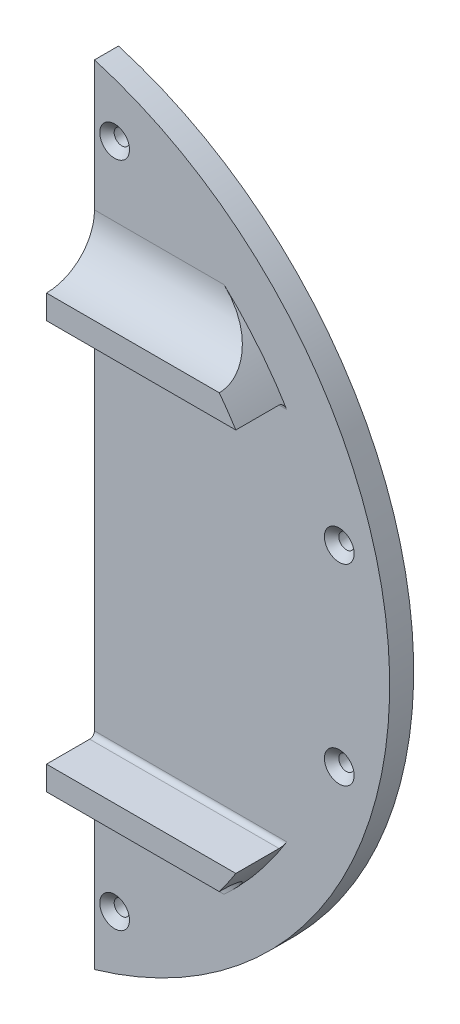
ISO-10303-21;
HEADER;
FILE_DESCRIPTION(('STEP AP214'),'2;1');
FILE_NAME('part.step','',(''),(''),'','','');
FILE_SCHEMA(('AUTOMOTIVE_DESIGN { 1 0 10303 214 1 1 1 1 }'));
ENDSEC;
DATA;
#1=APPLICATION_CONTEXT('core data for automotive mechanical design processes');
#2=APPLICATION_PROTOCOL_DEFINITION('international standard','automotive_design',2000,#1);
#3=PRODUCT_CONTEXT('',#1,'mechanical');
#4=PRODUCT('Part','Part','',(#3));
#5=PRODUCT_RELATED_PRODUCT_CATEGORY('part','',(#4));
#6=PRODUCT_DEFINITION_FORMATION('','',#4);
#7=PRODUCT_DEFINITION_CONTEXT('part definition',#1,'design');
#8=PRODUCT_DEFINITION('design','',#6,#7);
#9=PRODUCT_DEFINITION_SHAPE('','',#8);
#10=(LENGTH_UNIT() NAMED_UNIT(*) SI_UNIT(.MILLI.,.METRE.));
#11=(NAMED_UNIT(*) PLANE_ANGLE_UNIT() SI_UNIT($,.RADIAN.));
#12=(NAMED_UNIT(*) SI_UNIT($,.STERADIAN.) SOLID_ANGLE_UNIT());
#13=UNCERTAINTY_MEASURE_WITH_UNIT(LENGTH_MEASURE(1.E-05),#10,'distance_accuracy_value','');
#14=(GEOMETRIC_REPRESENTATION_CONTEXT(3) GLOBAL_UNCERTAINTY_ASSIGNED_CONTEXT((#13)) GLOBAL_UNIT_ASSIGNED_CONTEXT((#10,
#11,#12)) REPRESENTATION_CONTEXT('',''));
#15=CARTESIAN_POINT('',(0.,0.,0.));
#16=DIRECTION('',(0.,0.,1.));
#17=DIRECTION('',(1.,0.,0.));
#18=AXIS2_PLACEMENT_3D('',#15,#16,#17);
#19=CARTESIAN_POINT('',(0.,0.,5.));
#20=DIRECTION('',(0.,0.,1.));
#21=DIRECTION('',(1.,0.,0.));
#22=AXIS2_PLACEMENT_3D('',#19,#20,#21);
#23=PLANE('',#22);
#24=CARTESIAN_POINT('',(28.2,-69.5,5.));
#25=DIRECTION('',(0.,0.,1.));
#26=DIRECTION('',(1.,0.,0.));
#27=AXIS2_PLACEMENT_3D('',#24,#25,#26);
#28=CIRCLE('',#27,3.10000000000003);
#29=CARTESIAN_POINT('',(31.3,-69.5,5.));
#30=VERTEX_POINT('',#29);
#31=EDGE_CURVE('E249',#30,#30,#28,.F.);
#32=ORIENTED_EDGE('',*,*,#31,.T.);
#33=EDGE_LOOP('',(#32));
#34=FACE_BOUND('',#33,.T.);
#35=CARTESIAN_POINT('',(75.,-20.,5.));
#36=DIRECTION('',(0.,0.,1.));
#37=DIRECTION('',(1.,0.,0.));
#38=AXIS2_PLACEMENT_3D('',#35,#36,#37);
#39=CIRCLE('',#38,3.10000000000003);
#40=CARTESIAN_POINT('',(78.1,-20.,5.));
#41=VERTEX_POINT('',#40);
#42=EDGE_CURVE('E242',#41,#41,#39,.F.);
#43=ORIENTED_EDGE('',*,*,#42,.T.);
#44=EDGE_LOOP('',(#43));
#45=FACE_BOUND('',#44,.T.);
#46=CARTESIAN_POINT('',(74.9999999999999,20.,5.));
#47=DIRECTION('',(0.,0.,1.));
#48=DIRECTION('',(1.,0.,0.));
#49=AXIS2_PLACEMENT_3D('',#46,#47,#48);
#50=CIRCLE('',#49,3.10000000000003);
#51=CARTESIAN_POINT('',(78.1,20.,5.));
#52=VERTEX_POINT('',#51);
#53=EDGE_CURVE('E243',#52,#52,#50,.F.);
#54=ORIENTED_EDGE('',*,*,#53,.T.);
#55=EDGE_LOOP('',(#54));
#56=FACE_BOUND('',#55,.T.);
#57=CARTESIAN_POINT('',(28.2,69.5,5.));
#58=DIRECTION('',(0.,0.,1.));
#59=DIRECTION('',(1.,0.,0.));
#60=AXIS2_PLACEMENT_3D('',#57,#58,#59);
#61=CIRCLE('',#60,3.10000000000006);
#62=CARTESIAN_POINT('',(31.3000000000001,69.5,5.));
#63=VERTEX_POINT('',#62);
#64=EDGE_CURVE('E240',#63,#63,#61,.F.);
#65=ORIENTED_EDGE('',*,*,#64,.T.);
#66=EDGE_LOOP('',(#65));
#67=FACE_BOUND('',#66,.T.);
#68=DIRECTION('',(0.,-1.,0.));
#69=VECTOR('',#68,1.);
#70=CARTESIAN_POINT('',(24.,-82.0624761995396,5.));
#71=LINE('',#70,#69);
#72=CARTESIAN_POINT('',(24.,39.,5.));
#73=VERTEX_POINT('',#72);
#74=CARTESIAN_POINT('',(24.,-39.,5.));
#75=VERTEX_POINT('',#74);
#76=EDGE_CURVE('E219',#73,#75,#71,.T.);
#77=ORIENTED_EDGE('',*,*,#76,.T.);
#78=DIRECTION('',(-1.,0.,0.));
#79=VECTOR('',#78,1.);
#80=CARTESIAN_POINT('',(0.,-39.,5.));
#81=LINE('',#80,#79);
#82=CARTESIAN_POINT('',(64.0624695121879,-39.,5.));
#83=VERTEX_POINT('',#82);
#84=EDGE_CURVE('E409',#75,#83,#81,.F.);
#85=ORIENTED_EDGE('',*,*,#84,.T.);
#86=CARTESIAN_POINT('',(0.,0.,5.));
#87=DIRECTION('',(0.,0.,1.));
#88=DIRECTION('',(1.,0.,0.));
#89=AXIS2_PLACEMENT_3D('',#86,#87,#88);
#90=CIRCLE('',#89,75.);
#91=CARTESIAN_POINT('',(50.9901951359279,-55.,5.));
#92=VERTEX_POINT('',#91);
#93=EDGE_CURVE('E177',#92,#83,#90,.T.);
#94=ORIENTED_EDGE('',*,*,#93,.F.);
#95=DIRECTION('',(1.,0.,0.));
#96=VECTOR('',#95,1.);
#97=CARTESIAN_POINT('',(0.,-55.,5.));
#98=LINE('',#97,#96);
#99=CARTESIAN_POINT('',(24.,-55.,5.));
#100=VERTEX_POINT('',#99);
#101=EDGE_CURVE('E262',#92,#100,#98,.F.);
#102=ORIENTED_EDGE('',*,*,#101,.T.);
#103=CARTESIAN_POINT('',(24.,-82.0624761995396,5.));
#104=VERTEX_POINT('',#103);
#105=EDGE_CURVE('E213',#100,#104,#71,.T.);
#106=ORIENTED_EDGE('',*,*,#105,.T.);
#107=CARTESIAN_POINT('',(0.,0.,5.));
#108=DIRECTION('',(0.,0.,1.));
#109=DIRECTION('',(1.,0.,0.));
#110=AXIS2_PLACEMENT_3D('',#107,#108,#109);
#111=CIRCLE('',#110,85.5);
#112=CARTESIAN_POINT('',(24.,82.0624761995396,5.));
#113=VERTEX_POINT('',#112);
#114=EDGE_CURVE('E207',#104,#113,#111,.T.);
#115=ORIENTED_EDGE('',*,*,#114,.T.);
#116=CARTESIAN_POINT('',(24.,55.,5.));
#117=VERTEX_POINT('',#116);
#118=EDGE_CURVE('E214',#113,#117,#71,.T.);
#119=ORIENTED_EDGE('',*,*,#118,.T.);
#120=DIRECTION('',(-1.,0.,0.));
#121=VECTOR('',#120,1.);
#122=CARTESIAN_POINT('',(0.,55.,5.));
#123=LINE('',#122,#121);
#124=CARTESIAN_POINT('',(50.9901951359279,55.,5.));
#125=VERTEX_POINT('',#124);
#126=EDGE_CURVE('E270',#117,#125,#123,.F.);
#127=ORIENTED_EDGE('',*,*,#126,.T.);
#128=CARTESIAN_POINT('',(0.,0.,5.));
#129=DIRECTION('',(0.,0.,1.));
#130=DIRECTION('',(1.,0.,0.));
#131=AXIS2_PLACEMENT_3D('',#128,#129,#130);
#132=CIRCLE('',#131,75.);
#133=CARTESIAN_POINT('',(64.0624695121879,39.,5.));
#134=VERTEX_POINT('',#133);
#135=EDGE_CURVE('E154',#134,#125,#132,.T.);
#136=ORIENTED_EDGE('',*,*,#135,.F.);
#137=DIRECTION('',(1.,0.,0.));
#138=VECTOR('',#137,1.);
#139=CARTESIAN_POINT('',(0.,39.,5.));
#140=LINE('',#139,#138);
#141=EDGE_CURVE('E413',#134,#73,#140,.F.);
#142=ORIENTED_EDGE('',*,*,#141,.T.);
#143=EDGE_LOOP('',(#77,#85,#94,#102,#106,#115,#119,#127,#136,#142));
#144=FACE_BOUND('',#143,.T.);
#145=ADVANCED_FACE('F44',(#34,#45,#56,#67,#144),#23,.T.);
#146=CARTESIAN_POINT('',(0.,0.,0.));
#147=DIRECTION('',(0.,0.,1.));
#148=DIRECTION('',(1.,0.,0.));
#149=AXIS2_PLACEMENT_3D('',#146,#147,#148);
#150=PLANE('',#149);
#151=CARTESIAN_POINT('',(0.,0.,0.));
#152=DIRECTION('',(0.,0.,1.));
#153=DIRECTION('',(1.,0.,0.));
#154=AXIS2_PLACEMENT_3D('',#151,#152,#153);
#155=CIRCLE('',#154,85.5);
#156=CARTESIAN_POINT('',(24.,-82.0624761995396,0.));
#157=VERTEX_POINT('',#156);
#158=CARTESIAN_POINT('',(24.,82.0624761995396,0.));
#159=VERTEX_POINT('',#158);
#160=EDGE_CURVE('E208',#157,#159,#155,.T.);
#161=ORIENTED_EDGE('',*,*,#160,.F.);
#162=DIRECTION('',(0.,-1.,0.));
#163=VECTOR('',#162,1.);
#164=CARTESIAN_POINT('',(24.,-82.0624761995396,0.));
#165=LINE('',#164,#163);
#166=EDGE_CURVE('E212',#159,#157,#165,.T.);
#167=ORIENTED_EDGE('',*,*,#166,.F.);
#168=EDGE_LOOP('',(#161,#167));
#169=FACE_BOUND('',#168,.T.);
#170=CARTESIAN_POINT('',(75.,-20.,0.));
#171=DIRECTION('',(0.,0.,1.));
#172=DIRECTION('',(1.,0.,0.));
#173=AXIS2_PLACEMENT_3D('',#170,#171,#172);
#174=CIRCLE('',#173,1.6);
#175=CARTESIAN_POINT('',(76.6,-20.,0.));
#176=VERTEX_POINT('',#175);
#177=EDGE_CURVE('E204',#176,#176,#174,.T.);
#178=ORIENTED_EDGE('',*,*,#177,.T.);
#179=EDGE_LOOP('',(#178));
#180=FACE_BOUND('',#179,.T.);
#181=CARTESIAN_POINT('',(74.9999999999999,20.,0.));
#182=DIRECTION('',(0.,0.,1.));
#183=DIRECTION('',(-1.,0.,0.));
#184=AXIS2_PLACEMENT_3D('',#181,#182,#183);
#185=CIRCLE('',#184,1.6);
#186=CARTESIAN_POINT('',(73.3999999999999,20.,0.));
#187=VERTEX_POINT('',#186);
#188=EDGE_CURVE('E199',#187,#187,#185,.T.);
#189=ORIENTED_EDGE('',*,*,#188,.T.);
#190=EDGE_LOOP('',(#189));
#191=FACE_BOUND('',#190,.T.);
#192=CARTESIAN_POINT('',(28.2,-69.5,0.));
#193=DIRECTION('',(0.,0.,1.));
#194=DIRECTION('',(1.,0.,0.));
#195=AXIS2_PLACEMENT_3D('',#192,#193,#194);
#196=CIRCLE('',#195,1.6);
#197=CARTESIAN_POINT('',(29.8,-69.5,0.));
#198=VERTEX_POINT('',#197);
#199=EDGE_CURVE('E164',#198,#198,#196,.T.);
#200=ORIENTED_EDGE('',*,*,#199,.T.);
#201=EDGE_LOOP('',(#200));
#202=FACE_BOUND('',#201,.T.);
#203=CARTESIAN_POINT('',(28.2,69.5,0.));
#204=DIRECTION('',(0.,0.,1.));
#205=DIRECTION('',(-1.,0.,0.));
#206=AXIS2_PLACEMENT_3D('',#203,#204,#205);
#207=CIRCLE('',#206,1.6);
#208=CARTESIAN_POINT('',(26.6,69.5,0.));
#209=VERTEX_POINT('',#208);
#210=EDGE_CURVE('E157',#209,#209,#207,.T.);
#211=ORIENTED_EDGE('',*,*,#210,.T.);
#212=EDGE_LOOP('',(#211));
#213=FACE_BOUND('',#212,.T.);
#214=ADVANCED_FACE('F360',(#169,#180,#191,#202,#213),#150,.F.);
#215=CARTESIAN_POINT('',(0.,0.,5.));
#216=DIRECTION('',(0.,0.,-1.));
#217=DIRECTION('',(-1.,0.,0.));
#218=AXIS2_PLACEMENT_3D('',#215,#216,#217);
#219=CYLINDRICAL_SURFACE('',#218,85.5);
#220=ORIENTED_EDGE('',*,*,#160,.T.);
#221=DIRECTION('',(0.,0.,-1.));
#222=VECTOR('',#221,1.);
#223=CARTESIAN_POINT('',(24.,82.0624761995396,5.));
#224=LINE('',#223,#222);
#225=EDGE_CURVE('E229',#113,#159,#224,.T.);
#226=ORIENTED_EDGE('',*,*,#225,.F.);
#227=ORIENTED_EDGE('',*,*,#114,.F.);
#228=DIRECTION('',(0.,0.,-1.));
#229=VECTOR('',#228,1.);
#230=CARTESIAN_POINT('',(24.,-82.0624761995396,5.));
#231=LINE('',#230,#229);
#232=EDGE_CURVE('E218',#104,#157,#231,.T.);
#233=ORIENTED_EDGE('',*,*,#232,.T.);
#234=EDGE_LOOP('',(#220,#226,#227,#233));
#235=FACE_BOUND('',#234,.T.);
#236=ADVANCED_FACE('F363',(#235),#219,.T.);
#237=CARTESIAN_POINT('',(24.,-82.0624761995396,5.));
#238=DIRECTION('',(1.,0.,0.));
#239=DIRECTION('',(0.,0.,-1.));
#240=AXIS2_PLACEMENT_3D('',#237,#238,#239);
#241=PLANE('',#240);
#242=ORIENTED_EDGE('',*,*,#166,.T.);
#243=ORIENTED_EDGE('',*,*,#232,.F.);
#244=ORIENTED_EDGE('',*,*,#105,.F.);
#245=CARTESIAN_POINT('',(24.,-55.,15.));
#246=DIRECTION('',(1.,0.,0.));
#247=DIRECTION('',(0.,0.,-1.));
#248=AXIS2_PLACEMENT_3D('',#245,#246,#247);
#249=CIRCLE('',#248,10.);
#250=CARTESIAN_POINT('',(24.,-45.,15.));
#251=VERTEX_POINT('',#250);
#252=EDGE_CURVE('E424',#100,#251,#249,.T.);
#253=ORIENTED_EDGE('',*,*,#252,.T.);
#254=DIRECTION('',(0.,-1.,0.));
#255=VECTOR('',#254,1.);
#256=CARTESIAN_POINT('',(24.,-45.,15.));
#257=LINE('',#256,#255);
#258=CARTESIAN_POINT('',(24.,-40.,15.));
#259=VERTEX_POINT('',#258);
#260=EDGE_CURVE('E190',#259,#251,#257,.T.);
#261=ORIENTED_EDGE('',*,*,#260,.F.);
#262=DIRECTION('',(0.,0.,-1.));
#263=VECTOR('',#262,1.);
#264=CARTESIAN_POINT('',(24.,-40.,15.));
#265=LINE('',#264,#263);
#266=CARTESIAN_POINT('',(24.,-40.,6.));
#267=VERTEX_POINT('',#266);
#268=EDGE_CURVE('E172',#259,#267,#265,.T.);
#269=ORIENTED_EDGE('',*,*,#268,.T.);
#270=CARTESIAN_POINT('',(24.,-39.,6.));
#271=DIRECTION('',(1.,0.,0.));
#272=DIRECTION('',(0.,0.,-1.));
#273=AXIS2_PLACEMENT_3D('',#270,#271,#272);
#274=CIRCLE('',#273,1.);
#275=EDGE_CURVE('E317',#267,#75,#274,.T.);
#276=ORIENTED_EDGE('',*,*,#275,.T.);
#277=ORIENTED_EDGE('',*,*,#76,.F.);
#278=CARTESIAN_POINT('',(24.,39.,6.));
#279=DIRECTION('',(1.,0.,0.));
#280=DIRECTION('',(0.,0.,-1.));
#281=AXIS2_PLACEMENT_3D('',#278,#279,#280);
#282=CIRCLE('',#281,1.);
#283=CARTESIAN_POINT('',(24.,40.,6.));
#284=VERTEX_POINT('',#283);
#285=EDGE_CURVE('E11',#73,#284,#282,.T.);
#286=ORIENTED_EDGE('',*,*,#285,.T.);
#287=DIRECTION('',(0.,0.,-1.));
#288=VECTOR('',#287,1.);
#289=CARTESIAN_POINT('',(24.,40.,15.));
#290=LINE('',#289,#288);
#291=CARTESIAN_POINT('',(24.,40.,15.));
#292=VERTEX_POINT('',#291);
#293=EDGE_CURVE('E139',#292,#284,#290,.T.);
#294=ORIENTED_EDGE('',*,*,#293,.F.);
#295=DIRECTION('',(0.,-1.,0.));
#296=VECTOR('',#295,1.);
#297=CARTESIAN_POINT('',(24.,45.,15.));
#298=LINE('',#297,#296);
#299=CARTESIAN_POINT('',(24.,45.,15.));
#300=VERTEX_POINT('',#299);
#301=EDGE_CURVE('E150',#300,#292,#298,.T.);
#302=ORIENTED_EDGE('',*,*,#301,.F.);
#303=CARTESIAN_POINT('',(24.,55.,15.));
#304=DIRECTION('',(1.,0.,0.));
#305=DIRECTION('',(0.,0.,-1.));
#306=AXIS2_PLACEMENT_3D('',#303,#304,#305);
#307=CIRCLE('',#306,10.);
#308=EDGE_CURVE('E271',#300,#117,#307,.T.);
#309=ORIENTED_EDGE('',*,*,#308,.T.);
#310=ORIENTED_EDGE('',*,*,#118,.F.);
#311=ORIENTED_EDGE('',*,*,#225,.T.);
#312=EDGE_LOOP('',(#242,#243,#244,#253,#261,#269,#276,#277,#286,#294,#302,#309,#310,#311));
#313=FACE_BOUND('',#312,.T.);
#314=ADVANCED_FACE('F160',(#313),#241,.F.);
#315=CARTESIAN_POINT('',(75.,-20.,5.));
#316=DIRECTION('',(0.,0.,-1.));
#317=DIRECTION('',(-1.,0.,0.));
#318=AXIS2_PLACEMENT_3D('',#315,#316,#317);
#319=CYLINDRICAL_SURFACE('',#318,1.6);
#320=CARTESIAN_POINT('',(75.,-20.,3.49999999999998));
#321=DIRECTION('',(0.,0.,1.));
#322=DIRECTION('',(1.,0.,0.));
#323=AXIS2_PLACEMENT_3D('',#320,#321,#322);
#324=CIRCLE('',#323,1.6);
#325=CARTESIAN_POINT('',(76.6,-20.,3.49999999999998));
#326=VERTEX_POINT('',#325);
#327=EDGE_CURVE('E251',#326,#326,#324,.T.);
#328=ORIENTED_EDGE('',*,*,#327,.T.);
#329=EDGE_LOOP('',(#328));
#330=FACE_BOUND('',#329,.T.);
#331=ORIENTED_EDGE('',*,*,#177,.F.);
#332=EDGE_LOOP('',(#331));
#333=FACE_BOUND('',#332,.T.);
#334=ADVANCED_FACE('F348',(#330,#333),#319,.F.);
#335=CARTESIAN_POINT('',(74.9999999999999,20.,5.));
#336=DIRECTION('',(0.,0.,-1.));
#337=DIRECTION('',(-1.,0.,0.));
#338=AXIS2_PLACEMENT_3D('',#335,#336,#337);
#339=CYLINDRICAL_SURFACE('',#338,1.6);
#340=CARTESIAN_POINT('',(74.9999999999999,20.,3.49999999999998));
#341=DIRECTION('',(0.,0.,1.));
#342=DIRECTION('',(1.,0.,0.));
#343=AXIS2_PLACEMENT_3D('',#340,#341,#342);
#344=CIRCLE('',#343,1.6);
#345=CARTESIAN_POINT('',(76.6,20.,3.49999999999998));
#346=VERTEX_POINT('',#345);
#347=EDGE_CURVE('E258',#346,#346,#344,.T.);
#348=ORIENTED_EDGE('',*,*,#347,.T.);
#349=EDGE_LOOP('',(#348));
#350=FACE_BOUND('',#349,.T.);
#351=ORIENTED_EDGE('',*,*,#188,.F.);
#352=EDGE_LOOP('',(#351));
#353=FACE_BOUND('',#352,.T.);
#354=ADVANCED_FACE('F347',(#350,#353),#339,.F.);
#355=CARTESIAN_POINT('',(28.2,-69.5,5.));
#356=DIRECTION('',(0.,0.,-1.));
#357=DIRECTION('',(-1.,0.,0.));
#358=AXIS2_PLACEMENT_3D('',#355,#356,#357);
#359=CYLINDRICAL_SURFACE('',#358,1.6);
#360=CARTESIAN_POINT('',(28.2,-69.5,3.49999999999998));
#361=DIRECTION('',(0.,0.,1.));
#362=DIRECTION('',(1.,0.,0.));
#363=AXIS2_PLACEMENT_3D('',#360,#361,#362);
#364=CIRCLE('',#363,1.6);
#365=CARTESIAN_POINT('',(29.8,-69.5,3.49999999999998));
#366=VERTEX_POINT('',#365);
#367=EDGE_CURVE('E231',#366,#366,#364,.T.);
#368=ORIENTED_EDGE('',*,*,#367,.T.);
#369=EDGE_LOOP('',(#368));
#370=FACE_BOUND('',#369,.T.);
#371=ORIENTED_EDGE('',*,*,#199,.F.);
#372=EDGE_LOOP('',(#371));
#373=FACE_BOUND('',#372,.T.);
#374=ADVANCED_FACE('F345',(#370,#373),#359,.F.);
#375=CARTESIAN_POINT('',(28.2,69.5,5.));
#376=DIRECTION('',(0.,0.,-1.));
#377=DIRECTION('',(-1.,0.,0.));
#378=AXIS2_PLACEMENT_3D('',#375,#376,#377);
#379=CYLINDRICAL_SURFACE('',#378,1.6);
#380=CARTESIAN_POINT('',(28.2,69.5,3.49999999999995));
#381=DIRECTION('',(0.,0.,1.));
#382=DIRECTION('',(1.,0.,0.));
#383=AXIS2_PLACEMENT_3D('',#380,#381,#382);
#384=CIRCLE('',#383,1.6);
#385=CARTESIAN_POINT('',(29.8,69.5,3.49999999999995));
#386=VERTEX_POINT('',#385);
#387=EDGE_CURVE('E257',#386,#386,#384,.T.);
#388=ORIENTED_EDGE('',*,*,#387,.T.);
#389=EDGE_LOOP('',(#388));
#390=FACE_BOUND('',#389,.T.);
#391=ORIENTED_EDGE('',*,*,#210,.F.);
#392=EDGE_LOOP('',(#391));
#393=FACE_BOUND('',#392,.T.);
#394=ADVANCED_FACE('F329',(#390,#393),#379,.F.);
#395=CARTESIAN_POINT('',(0.,0.,15.));
#396=DIRECTION('',(0.,0.,-1.));
#397=DIRECTION('',(-1.,0.,0.));
#398=AXIS2_PLACEMENT_3D('',#395,#396,#397);
#399=CYLINDRICAL_SURFACE('',#398,75.);
#400=ORIENTED_EDGE('',*,*,#93,.T.);
#401=CARTESIAN_POINT('',(64.0624695121879,-39.,5.));
#402=CARTESIAN_POINT('',(64.0182938721023,-39.0725788608507,4.99999151526642));
#403=CARTESIAN_POINT('',(63.9739169274228,-39.1451816755448,5.00790586062225));
#404=CARTESIAN_POINT('',(63.8861823514557,-39.2881977517815,5.03961302115589));
#405=CARTESIAN_POINT('',(63.8428342205697,-39.3585917563702,5.06351842515683));
#406=CARTESIAN_POINT('',(63.7639354792566,-39.4862710131402,5.1236725965276));
#407=CARTESIAN_POINT('',(63.7280551973718,-39.5441415735194,5.15824003958152));
#408=CARTESIAN_POINT('',(63.6603707811398,-39.6530106922438,5.23962806031894));
#409=CARTESIAN_POINT('',(63.6285508104739,-39.7040359916469,5.28639872236614));
#410=CARTESIAN_POINT('',(63.5785400017744,-39.7840527491108,5.37720758103962));
#411=CARTESIAN_POINT('',(63.5589923294947,-39.8152683862539,5.4185528288533));
#412=CARTESIAN_POINT('',(63.5237364203521,-39.8714937106989,5.50681531508395));
#413=CARTESIAN_POINT('',(63.5080289646337,-39.8965021353977,5.55373368425906));
#414=CARTESIAN_POINT('',(63.4811856524273,-39.9392002229486,5.65241683448539));
#415=CARTESIAN_POINT('',(63.4700806279951,-39.9568405321643,5.70421153622735));
#416=CARTESIAN_POINT('',(63.4533168255416,-39.9834570592998,5.8107674997966));
#417=CARTESIAN_POINT('',(63.4476441143916,-39.9924554427305,5.865520789693));
#418=CARTESIAN_POINT('',(63.444211564214,-39.9979001746269,5.93387385205681));
#419=CARTESIAN_POINT('',(63.4437150685772,-39.9986877021572,5.94709128749052));
#420=CARTESIAN_POINT('',(63.4430537065147,-39.9997367187003,5.97353719714756));
#421=CARTESIAN_POINT('',(63.4428883872757,-39.9999989259769,5.98676563152387));
#422=CARTESIAN_POINT('',(63.4428877022476,-40.,6.));
#423=B_SPLINE_CURVE_WITH_KNOTS('',3,(#401,#402,#403,#404,#405,#406,#407,#408,#409,#410,#411,
#412,#413,#414,#415,#416,#417,#418,#419,#420,#421,#422),.UNSPECIFIED.,.F.,.F.,(4,2,2,2,2,2,2,2,
2,2,4),(0.,0.254755426187293,0.511323666039435,0.739170786662887,0.966100154344196,
1.13154608588375,1.29702564308917,1.46359650952261,1.62973899139889,1.66948099106271,
1.70916861480881),.UNSPECIFIED.);
#424=CARTESIAN_POINT('',(63.4428877022476,-40.,6.));
#425=VERTEX_POINT('',#424);
#426=EDGE_CURVE('E315',#83,#425,#423,.T.);
#427=ORIENTED_EDGE('',*,*,#426,.T.);
#428=DIRECTION('',(0.,0.,-1.));
#429=VECTOR('',#428,1.);
#430=CARTESIAN_POINT('',(63.4428877022476,-40.,15.));
#431=LINE('',#430,#429);
#432=CARTESIAN_POINT('',(63.4428877022476,-40.,15.));
#433=VERTEX_POINT('',#432);
#434=EDGE_CURVE('E173',#433,#425,#431,.T.);
#435=ORIENTED_EDGE('',*,*,#434,.F.);
#436=CARTESIAN_POINT('',(0.,0.,15.));
#437=DIRECTION('',(0.,0.,1.));
#438=DIRECTION('',(1.,0.,0.));
#439=AXIS2_PLACEMENT_3D('',#436,#437,#438);
#440=CIRCLE('',#439,75.);
#441=CARTESIAN_POINT('',(60.,-45.,15.));
#442=VERTEX_POINT('',#441);
#443=EDGE_CURVE('E181',#442,#433,#440,.T.);
#444=ORIENTED_EDGE('',*,*,#443,.F.);
#445=CARTESIAN_POINT('',(60.,-45.,15.));
#446=CARTESIAN_POINT('',(60.0000002783246,-44.9999988711789,14.8806822322616));
#447=CARTESIAN_POINT('',(59.998398045374,-45.002136033364,14.7613808404537));
#448=CARTESIAN_POINT('',(59.9919962918884,-45.0106700932607,14.5230207608918));
#449=CARTESIAN_POINT('',(59.987196888764,-45.0170668345466,14.4039620643864));
#450=CARTESIAN_POINT('',(59.9680223022924,-45.0426108000703,14.0475995860851));
#451=CARTESIAN_POINT('',(59.9488707206311,-45.0681118095629,13.8109604950043));
#452=CARTESIAN_POINT('',(59.8981718373105,-45.1354712142419,13.3426600380958));
#453=CARTESIAN_POINT('',(59.8666883428413,-45.1772454035308,13.110979422357));
#454=CARTESIAN_POINT('',(59.7916575431274,-45.2765011187096,12.6529876477691));
#455=CARTESIAN_POINT('',(59.7481096029396,-45.3339834713067,12.4266767722063));
#456=CARTESIAN_POINT('',(59.6494670971802,-45.4636964449836,11.9812839318763));
#457=CARTESIAN_POINT('',(59.5943889974416,-45.5359060308505,11.7621921686524));
#458=CARTESIAN_POINT('',(59.4731571368583,-45.6941299088675,11.3321254475026));
#459=CARTESIAN_POINT('',(59.4069990951962,-45.7801495360955,11.1211536656858));
#460=CARTESIAN_POINT('',(59.2641770461182,-45.9648882219811,10.7083901923189));
#461=CARTESIAN_POINT('',(59.187506959468,-46.0636146270728,10.5066039034488));
#462=CARTESIAN_POINT('',(59.0243003546817,-46.2725571125303,10.1131417716661));
#463=CARTESIAN_POINT('',(58.9377601199591,-46.3827775195946,9.92146977727313));
#464=CARTESIAN_POINT('',(58.7503958341386,-46.6198999392793,9.53855031339029));
#465=CARTESIAN_POINT('',(58.6490436086096,-46.7473901595935,9.3479261345402));
#466=CARTESIAN_POINT('',(58.4368437469109,-47.0123825693132,8.97924138150379));
#467=CARTESIAN_POINT('',(58.3259924205499,-47.1498886465187,8.80118573935315));
#468=CARTESIAN_POINT('',(58.0956448784296,-47.4334204977374,8.45810615322549));
#469=CARTESIAN_POINT('',(57.9761525528391,-47.5794424322606,8.29307641413001));
#470=CARTESIAN_POINT('',(57.7292067565462,-47.878767414251,7.97607003848485));
#471=CARTESIAN_POINT('',(57.601751710147,-48.032071901373,7.82409599967366));
#472=CARTESIAN_POINT('',(57.2779850085853,-48.4182011985581,7.46485559500678));
#473=CARTESIAN_POINT('',(57.0774503924504,-48.6545548353292,7.2651468159853));
#474=CARTESIAN_POINT('',(56.6627416573932,-49.136900376952,6.89340646285061));
#475=CARTESIAN_POINT('',(56.4485623940782,-49.3828959034405,6.72138541497888));
#476=CARTESIAN_POINT('',(56.0075283860202,-49.8825444480041,6.40350775282171));
#477=CARTESIAN_POINT('',(55.780624648798,-50.1362250481643,6.25776288092533));
#478=CARTESIAN_POINT('',(55.3165751961392,-50.647762701165,5.99216336681545));
#479=CARTESIAN_POINT('',(55.079427090291,-50.9056207198922,5.87231480680856));
#480=CARTESIAN_POINT('',(54.5366625890479,-51.4873500548798,5.6307150568991));
#481=CARTESIAN_POINT('',(54.2286050103229,-51.8117920771194,5.51580848320696));
#482=CARTESIAN_POINT('',(53.6011616140605,-52.4606464192703,5.32185764761502));
#483=CARTESIAN_POINT('',(53.2817693425585,-52.7850586132848,5.24283418257015));
#484=CARTESIAN_POINT('',(52.6373959468544,-53.4276075362168,5.11903668784189));
#485=CARTESIAN_POINT('',(52.3125146261947,-53.7457740630554,5.07389630223056));
#486=CARTESIAN_POINT('',(51.8200941822941,-54.2192741641645,5.02926499012317));
#487=CARTESIAN_POINT('',(51.6552094673968,-54.3763850617959,5.01823412902346));
#488=CARTESIAN_POINT('',(51.3238540897245,-54.6892487047467,5.00360379971967));
#489=CARTESIAN_POINT('',(51.1573835612688,-54.8450015629898,5.00000370765017));
#490=CARTESIAN_POINT('',(50.9901951359279,-55.,5.));
#491=B_SPLINE_CURVE_WITH_KNOTS('',3,(#445,#446,#447,#448,#449,#450,#451,#452,#453,#454,#455,
#456,#457,#458,#459,#460,#461,#462,#463,#464,#465,#466,#467,#468,#469,#470,#471,#472,#473,#474,
#475,#476,#477,#478,#479,#480,#481,#482,#483,#484,#485,#486,#487,#488,#489,#490),.UNSPECIFIED.,
.F.,.F.,(4,2,2,2,2,2,2,2,2,2,2,2,2,2,2,2,2,2,2,2,2,2,4),(0.,0.357890906473997,0.715768670742501,
1.43107904843353,2.14273617997127,2.8544307726317,3.56511586796538,4.27607617786778,
4.98744939214431,5.69909136263356,6.4505343409763,7.20227057336062,7.95367045690851,
8.70521950450723,9.80977260617501,10.9147446468094,12.0243102245297,13.1341361207545,
14.5181417853663,15.9029485606761,17.2725576437873,17.9565034230167,18.6403917778428),.UNSPECIFIED.);
#492=EDGE_CURVE('E281',#442,#92,#491,.T.);
#493=ORIENTED_EDGE('',*,*,#492,.T.);
#494=EDGE_LOOP('',(#400,#427,#435,#444,#493));
#495=FACE_BOUND('',#494,.T.);
#496=ADVANCED_FACE('F324',(#495),#399,.T.);
#497=CARTESIAN_POINT('',(63.4428877022476,-40.,15.));
#498=DIRECTION('',(0.,-1.,0.));
#499=DIRECTION('',(0.,0.,-1.));
#500=AXIS2_PLACEMENT_3D('',#497,#498,#499);
#501=PLANE('',#500);
#502=ORIENTED_EDGE('',*,*,#434,.T.);
#503=DIRECTION('',(-1.,0.,0.));
#504=VECTOR('',#503,1.);
#505=CARTESIAN_POINT('',(63.4428877022476,-40.,6.));
#506=LINE('',#505,#504);
#507=EDGE_CURVE('E419',#425,#267,#506,.T.);
#508=ORIENTED_EDGE('',*,*,#507,.T.);
#509=ORIENTED_EDGE('',*,*,#268,.F.);
#510=DIRECTION('',(-1.,0.,0.));
#511=VECTOR('',#510,1.);
#512=CARTESIAN_POINT('',(63.4428877022476,-40.,15.));
#513=LINE('',#512,#511);
#514=EDGE_CURVE('E193',#433,#259,#513,.T.);
#515=ORIENTED_EDGE('',*,*,#514,.F.);
#516=EDGE_LOOP('',(#502,#508,#509,#515));
#517=FACE_BOUND('',#516,.T.);
#518=ADVANCED_FACE('F328',(#517),#501,.F.);
#519=CARTESIAN_POINT('',(0.,0.,15.));
#520=DIRECTION('',(0.,0.,1.));
#521=DIRECTION('',(1.,0.,0.));
#522=AXIS2_PLACEMENT_3D('',#519,#520,#521);
#523=PLANE('',#522);
#524=ORIENTED_EDGE('',*,*,#443,.T.);
#525=ORIENTED_EDGE('',*,*,#514,.T.);
#526=ORIENTED_EDGE('',*,*,#260,.T.);
#527=DIRECTION('',(1.,0.,0.));
#528=VECTOR('',#527,1.);
#529=CARTESIAN_POINT('',(60.,-45.,15.));
#530=LINE('',#529,#528);
#531=EDGE_CURVE('E179',#251,#442,#530,.T.);
#532=ORIENTED_EDGE('',*,*,#531,.T.);
#533=EDGE_LOOP('',(#524,#525,#526,#532));
#534=FACE_BOUND('',#533,.T.);
#535=ADVANCED_FACE('F333',(#534),#523,.T.);
#536=CARTESIAN_POINT('',(63.4428877022476,40.,15.));
#537=DIRECTION('',(0.,1.,0.));
#538=DIRECTION('',(0.,0.,1.));
#539=AXIS2_PLACEMENT_3D('',#536,#537,#538);
#540=PLANE('',#539);
#541=ORIENTED_EDGE('',*,*,#293,.T.);
#542=DIRECTION('',(1.,0.,0.));
#543=VECTOR('',#542,1.);
#544=CARTESIAN_POINT('',(63.4428877022476,40.,6.));
#545=LINE('',#544,#543);
#546=CARTESIAN_POINT('',(63.4428877022476,40.,6.));
#547=VERTEX_POINT('',#546);
#548=EDGE_CURVE('E418',#284,#547,#545,.T.);
#549=ORIENTED_EDGE('',*,*,#548,.T.);
#550=DIRECTION('',(0.,0.,-1.));
#551=VECTOR('',#550,1.);
#552=CARTESIAN_POINT('',(63.4428877022476,40.,15.));
#553=LINE('',#552,#551);
#554=CARTESIAN_POINT('',(63.4428877022476,40.,15.));
#555=VERTEX_POINT('',#554);
#556=EDGE_CURVE('E143',#555,#547,#553,.T.);
#557=ORIENTED_EDGE('',*,*,#556,.F.);
#558=DIRECTION('',(1.,0.,0.));
#559=VECTOR('',#558,1.);
#560=CARTESIAN_POINT('',(63.4428877022476,40.,15.));
#561=LINE('',#560,#559);
#562=EDGE_CURVE('E138',#292,#555,#561,.T.);
#563=ORIENTED_EDGE('',*,*,#562,.F.);
#564=EDGE_LOOP('',(#541,#549,#557,#563));
#565=FACE_BOUND('',#564,.T.);
#566=ADVANCED_FACE('F136',(#565),#540,.F.);
#567=CARTESIAN_POINT('',(0.,0.,15.));
#568=DIRECTION('',(0.,0.,-1.));
#569=DIRECTION('',(-1.,0.,0.));
#570=AXIS2_PLACEMENT_3D('',#567,#568,#569);
#571=CYLINDRICAL_SURFACE('',#570,75.);
#572=ORIENTED_EDGE('',*,*,#135,.T.);
#573=CARTESIAN_POINT('',(50.9901951359279,55.,5.));
#574=CARTESIAN_POINT('',(51.1785447236759,54.825383734982,5.00000613581409));
#575=CARTESIAN_POINT('',(51.3659813433954,54.6498109397368,5.00457391229637));
#576=CARTESIAN_POINT('',(51.7388196740695,54.2969650894246,5.02317735908863));
#577=CARTESIAN_POINT('',(51.9242210962093,54.1196917995618,5.03721435596491));
#578=CARTESIAN_POINT('',(52.4777587345168,53.5849622301339,5.0941244381748));
#579=CARTESIAN_POINT('',(52.8424303243432,53.2253361951729,5.15179958471374));
#580=CARTESIAN_POINT('',(53.5635710462978,52.4996036392492,5.31044525880866));
#581=CARTESIAN_POINT('',(53.919913124231,52.1334687715239,5.41186594637));
#582=CARTESIAN_POINT('',(54.616985883196,51.4027159895926,5.66145729955241));
#583=CARTESIAN_POINT('',(54.9577327542344,51.0380968766981,5.80957816246793));
#584=CARTESIAN_POINT('',(55.50719821967,50.43863244946,6.09698392191345));
#585=CARTESIAN_POINT('',(55.7213426371445,50.2019010677916,6.22208265509611));
#586=CARTESIAN_POINT('',(56.140077867292,49.7331908809094,6.49504646260256));
#587=CARTESIAN_POINT('',(56.3446711444735,49.5012108584569,6.64290562119593));
#588=CARTESIAN_POINT('',(56.7422042927853,49.0450148675833,6.96163598600422));
#589=CARTESIAN_POINT('',(56.9351843408281,48.8207734313747,7.13242035572054));
#590=CARTESIAN_POINT('',(57.3087466871575,48.3817173972599,7.49800713806173));
#591=CARTESIAN_POINT('',(57.4893312788038,48.1669010582265,7.69280508903794));
#592=CARTESIAN_POINT('',(57.8055800094115,47.786659196785,8.06991115023739));
#593=CARTESIAN_POINT('',(57.9435269175657,47.6192363569992,8.24829570166155));
#594=CARTESIAN_POINT('',(58.2088632982109,47.2945258019858,8.62137955701548));
#595=CARTESIAN_POINT('',(58.3362547149208,47.1372362215032,8.81607584313648));
#596=CARTESIAN_POINT('',(58.57952465773,46.8345709011188,9.22160694307244));
#597=CARTESIAN_POINT('',(58.6953943012645,46.6892043680303,9.43245398980039));
#598=CARTESIAN_POINT('',(58.9144093518636,46.4125361349067,9.86947020328468));
#599=CARTESIAN_POINT('',(59.0175548907554,46.2812342891572,10.0956392112613));
#600=CARTESIAN_POINT('',(59.2108774030902,46.0336496656076,10.564303202658));
#601=CARTESIAN_POINT('',(59.3009313556883,45.9175102902353,10.8069250987511));
#602=CARTESIAN_POINT('',(59.4658725053691,45.7037006855909,11.3051021571151));
#603=CARTESIAN_POINT('',(59.5407622274235,45.6060273817428,11.5606551573768));
#604=CARTESIAN_POINT('',(59.6742888701601,45.4311715633078,12.0822876281148));
#605=CARTESIAN_POINT('',(59.7329539634526,45.3539535399233,12.34834792352));
#606=CARTESIAN_POINT('',(59.8333421036409,45.2214340929135,12.8888341692567));
#607=CARTESIAN_POINT('',(59.8750752420654,45.16611961514,13.1632550314769));
#608=CARTESIAN_POINT('',(59.9385737208784,45.0818140877517,13.6972681170916));
#609=CARTESIAN_POINT('',(59.9615915925458,45.0511734761963,13.9564484681656));
#610=CARTESIAN_POINT('',(59.9846258609066,45.0204931337892,14.3469256527659));
#611=CARTESIAN_POINT('',(59.9903885228201,45.0128131249501,14.4773421221872));
#612=CARTESIAN_POINT('',(59.9980760293258,45.0025654190455,14.7384989266145));
#613=CARTESIAN_POINT('',(60.000000569036,44.9999981281097,14.869239286523));
#614=CARTESIAN_POINT('',(60.,45.,15.));
#615=B_SPLINE_CURVE_WITH_KNOTS('',3,(#573,#574,#575,#576,#577,#578,#579,#580,#581,#582,#583,
#584,#585,#586,#587,#588,#589,#590,#591,#592,#593,#594,#595,#596,#597,#598,#599,#600,#601,#602,
#603,#604,#605,#606,#607,#608,#609,#610,#611,#612,#613,#614),.UNSPECIFIED.,.F.,.F.,(4,2,2,2,2,2,
2,2,2,2,2,2,2,2,2,2,2,2,2,2,4),(0.,0.770428373109318,1.54096469983954,3.08529328042491,
4.6459076689925,6.20486336116686,7.23262822167579,8.26012640238018,9.28383700360315,
10.3073576884441,11.149146516877,11.9907799497235,12.833057278924,13.6753258810372,
14.5250582621271,15.3746490390858,16.2227551808775,17.0703551020362,17.8550207490367,
18.2471920689705,18.639394539864),.UNSPECIFIED.);
#616=CARTESIAN_POINT('',(60.,45.,15.));
#617=VERTEX_POINT('',#616);
#618=EDGE_CURVE('E273',#125,#617,#615,.T.);
#619=ORIENTED_EDGE('',*,*,#618,.T.);
#620=CARTESIAN_POINT('',(0.,0.,15.));
#621=DIRECTION('',(0.,0.,1.));
#622=DIRECTION('',(1.,0.,0.));
#623=AXIS2_PLACEMENT_3D('',#620,#621,#622);
#624=CIRCLE('',#623,75.);
#625=EDGE_CURVE('E148',#555,#617,#624,.T.);
#626=ORIENTED_EDGE('',*,*,#625,.F.);
#627=ORIENTED_EDGE('',*,*,#556,.T.);
#628=CARTESIAN_POINT('',(63.4428877022476,40.,6.));
#629=CARTESIAN_POINT('',(63.442886497269,40.0000017566952,5.97492692489152));
#630=CARTESIAN_POINT('',(63.443482716119,39.999056279152,5.94986723220182));
#631=CARTESIAN_POINT('',(63.445852496915,39.9952973290707,5.89995392251816));
#632=CARTESIAN_POINT('',(63.4476256034736,39.9924845790588,5.87510022957898));
#633=CARTESIAN_POINT('',(63.4546580021495,39.9813263804345,5.80136786961972));
#634=CARTESIAN_POINT('',(63.4616308262494,39.9702602921576,5.75302951869182));
#635=CARTESIAN_POINT('',(63.4797613161893,39.9414595050739,5.65932483371981));
#636=CARTESIAN_POINT('',(63.4909143325275,39.923732215265,5.6139552632027));
#637=CARTESIAN_POINT('',(63.5168784343342,39.8824115117449,5.52706578356336));
#638=CARTESIAN_POINT('',(63.5316932429896,39.8588121273216,5.48554985215884));
#639=CARTESIAN_POINT('',(63.565348297671,39.8051197020419,5.40479312036581));
#640=CARTESIAN_POINT('',(63.5843746410195,39.7747254131412,5.36583159580868));
#641=CARTESIAN_POINT('',(63.6251665504197,39.7094404934469,5.29355229108405));
#642=CARTESIAN_POINT('',(63.6469326393622,39.6745490043149,5.26023559110801));
#643=CARTESIAN_POINT('',(63.6959340985661,39.5958384607711,5.19504302711482));
#644=CARTESIAN_POINT('',(63.7235035331132,39.5514604195375,5.1640937428896));
#645=CARTESIAN_POINT('',(63.7806355950306,39.4592635692409,5.11009136841974));
#646=CARTESIAN_POINT('',(63.8102007774235,39.4114403440693,5.08704863897518));
#647=CARTESIAN_POINT('',(63.8763354528186,39.30417798515,5.04533537673946));
#648=CARTESIAN_POINT('',(63.9131700763859,39.2442557449243,5.02832238307031));
#649=CARTESIAN_POINT('',(63.9875363080818,39.1228885549261,5.00566513535234));
#650=CARTESIAN_POINT('',(64.0250662858997,39.0614470758556,4.9999970262467));
#651=CARTESIAN_POINT('',(64.0624695121879,39.,5.));
#652=B_SPLINE_CURVE_WITH_KNOTS('',3,(#628,#629,#630,#631,#632,#633,#634,#635,#636,#637,#638,
#639,#640,#641,#642,#643,#644,#645,#646,#647,#648,#649,#650,#651),.UNSPECIFIED.,.F.,.F.,(4,2,2,
2,2,2,2,2,2,2,2,4),(0.,0.0751683950733118,0.150307721279174,0.299733215951464,0.448993000008809,
0.598405175213199,0.756643622043513,0.914912315205228,1.09637367189153,1.27807191662086,
1.49422329334013,1.70991968585862),.UNSPECIFIED.);
#653=EDGE_CURVE('E54',#547,#134,#652,.T.);
#654=ORIENTED_EDGE('',*,*,#653,.T.);
#655=EDGE_LOOP('',(#572,#619,#626,#627,#654));
#656=FACE_BOUND('',#655,.T.);
#657=ADVANCED_FACE('F292',(#656),#571,.T.);
#658=CARTESIAN_POINT('',(0.,0.,15.));
#659=DIRECTION('',(0.,0.,1.));
#660=DIRECTION('',(1.,0.,0.));
#661=AXIS2_PLACEMENT_3D('',#658,#659,#660);
#662=PLANE('',#661);
#663=ORIENTED_EDGE('',*,*,#301,.T.);
#664=ORIENTED_EDGE('',*,*,#562,.T.);
#665=ORIENTED_EDGE('',*,*,#625,.T.);
#666=DIRECTION('',(-1.,0.,0.));
#667=VECTOR('',#666,1.);
#668=CARTESIAN_POINT('',(60.,45.,15.));
#669=LINE('',#668,#667);
#670=EDGE_CURVE('E153',#617,#300,#669,.T.);
#671=ORIENTED_EDGE('',*,*,#670,.T.);
#672=EDGE_LOOP('',(#663,#664,#665,#671));
#673=FACE_BOUND('',#672,.T.);
#674=ADVANCED_FACE('F151',(#673),#662,.T.);
#675=CARTESIAN_POINT('',(28.2,-69.5,3.49999999999998));
#676=DIRECTION('',(0.,0.,1.));
#677=DIRECTION('',(1.,0.,0.));
#678=AXIS2_PLACEMENT_3D('',#675,#676,#677);
#679=CONICAL_SURFACE('',#678,1.6,0.785398163397451);
#680=ORIENTED_EDGE('',*,*,#31,.F.);
#681=EDGE_LOOP('',(#680));
#682=FACE_BOUND('',#681,.T.);
#683=ORIENTED_EDGE('',*,*,#367,.F.);
#684=EDGE_LOOP('',(#683));
#685=FACE_BOUND('',#684,.T.);
#686=ADVANCED_FACE('F369',(#682,#685),#679,.F.);
#687=CARTESIAN_POINT('',(75.,-20.,3.49999999999998));
#688=DIRECTION('',(0.,0.,1.));
#689=DIRECTION('',(1.,0.,0.));
#690=AXIS2_PLACEMENT_3D('',#687,#688,#689);
#691=CONICAL_SURFACE('',#690,1.6,0.785398163397451);
#692=ORIENTED_EDGE('',*,*,#42,.F.);
#693=EDGE_LOOP('',(#692));
#694=FACE_BOUND('',#693,.T.);
#695=ORIENTED_EDGE('',*,*,#327,.F.);
#696=EDGE_LOOP('',(#695));
#697=FACE_BOUND('',#696,.T.);
#698=ADVANCED_FACE('F374',(#694,#697),#691,.F.);
#699=CARTESIAN_POINT('',(74.9999999999999,20.,3.49999999999998));
#700=DIRECTION('',(0.,0.,1.));
#701=DIRECTION('',(1.,0.,0.));
#702=AXIS2_PLACEMENT_3D('',#699,#700,#701);
#703=CONICAL_SURFACE('',#702,1.6,0.785398163397451);
#704=ORIENTED_EDGE('',*,*,#53,.F.);
#705=EDGE_LOOP('',(#704));
#706=FACE_BOUND('',#705,.T.);
#707=ORIENTED_EDGE('',*,*,#347,.F.);
#708=EDGE_LOOP('',(#707));
#709=FACE_BOUND('',#708,.T.);
#710=ADVANCED_FACE('F381',(#706,#709),#703,.F.);
#711=CARTESIAN_POINT('',(28.2,69.5,3.49999999999995));
#712=DIRECTION('',(0.,0.,1.));
#713=DIRECTION('',(1.,0.,0.));
#714=AXIS2_PLACEMENT_3D('',#711,#712,#713);
#715=CONICAL_SURFACE('',#714,1.6,0.785398163397452);
#716=ORIENTED_EDGE('',*,*,#64,.F.);
#717=EDGE_LOOP('',(#716));
#718=FACE_BOUND('',#717,.T.);
#719=ORIENTED_EDGE('',*,*,#387,.F.);
#720=EDGE_LOOP('',(#719));
#721=FACE_BOUND('',#720,.T.);
#722=ADVANCED_FACE('F297',(#718,#721),#715,.F.);
#723=CARTESIAN_POINT('',(60.,55.,15.));
#724=DIRECTION('',(-1.,0.,0.));
#725=DIRECTION('',(0.,0.,1.));
#726=AXIS2_PLACEMENT_3D('',#723,#724,#725);
#727=CYLINDRICAL_SURFACE('',#726,10.);
#728=ORIENTED_EDGE('',*,*,#618,.F.);
#729=ORIENTED_EDGE('',*,*,#126,.F.);
#730=ORIENTED_EDGE('',*,*,#308,.F.);
#731=ORIENTED_EDGE('',*,*,#670,.F.);
#732=EDGE_LOOP('',(#728,#729,#730,#731));
#733=FACE_BOUND('',#732,.T.);
#734=ADVANCED_FACE('F293',(#733),#727,.F.);
#735=CARTESIAN_POINT('',(60.,-55.,15.));
#736=DIRECTION('',(1.,0.,0.));
#737=DIRECTION('',(0.,0.,-1.));
#738=AXIS2_PLACEMENT_3D('',#735,#736,#737);
#739=CYLINDRICAL_SURFACE('',#738,10.);
#740=ORIENTED_EDGE('',*,*,#252,.F.);
#741=ORIENTED_EDGE('',*,*,#101,.F.);
#742=ORIENTED_EDGE('',*,*,#492,.F.);
#743=ORIENTED_EDGE('',*,*,#531,.F.);
#744=EDGE_LOOP('',(#740,#741,#742,#743));
#745=FACE_BOUND('',#744,.T.);
#746=ADVANCED_FACE('F299',(#745),#739,.F.);
#747=CARTESIAN_POINT('',(63.4428877022476,-39.,6.));
#748=DIRECTION('',(-1.,0.,0.));
#749=DIRECTION('',(0.,0.,1.));
#750=AXIS2_PLACEMENT_3D('',#747,#748,#749);
#751=CYLINDRICAL_SURFACE('',#750,1.);
#752=ORIENTED_EDGE('',*,*,#426,.F.);
#753=ORIENTED_EDGE('',*,*,#84,.F.);
#754=ORIENTED_EDGE('',*,*,#275,.F.);
#755=ORIENTED_EDGE('',*,*,#507,.F.);
#756=EDGE_LOOP('',(#752,#753,#754,#755));
#757=FACE_BOUND('',#756,.T.);
#758=ADVANCED_FACE('F308',(#757),#751,.F.);
#759=CARTESIAN_POINT('',(63.4428877022476,39.,6.));
#760=DIRECTION('',(1.,0.,0.));
#761=DIRECTION('',(0.,0.,-1.));
#762=AXIS2_PLACEMENT_3D('',#759,#760,#761);
#763=CYLINDRICAL_SURFACE('',#762,1.);
#764=ORIENTED_EDGE('',*,*,#285,.F.);
#765=ORIENTED_EDGE('',*,*,#141,.F.);
#766=ORIENTED_EDGE('',*,*,#653,.F.);
#767=ORIENTED_EDGE('',*,*,#548,.F.);
#768=EDGE_LOOP('',(#764,#765,#766,#767));
#769=FACE_BOUND('',#768,.T.);
#770=ADVANCED_FACE('F50',(#769),#763,.F.);
#771=CLOSED_SHELL('',(#145,#214,#236,#314,#334,#354,#374,#394,#496,#518,#535,#566,#657,#674,
#686,#698,#710,#722,#734,#746,#758,#770));
#772=MANIFOLD_SOLID_BREP('B2',#771);
#773=ADVANCED_BREP_SHAPE_REPRESENTATION('',(#18,#772),#14);
#774=SHAPE_DEFINITION_REPRESENTATION(#9,#773);
ENDSEC;
END-ISO-10303-21;
